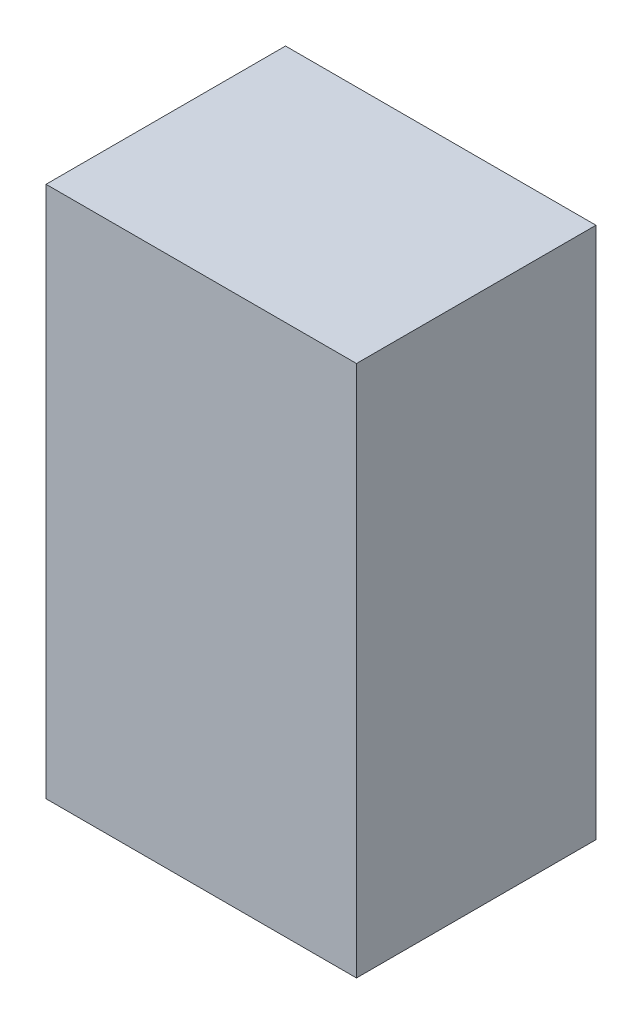
ISO-10303-21;
HEADER;
FILE_DESCRIPTION(('STEP AP214'),'2;1');
FILE_NAME('part.step','',(''),(''),'','','');
FILE_SCHEMA(('AUTOMOTIVE_DESIGN { 1 0 10303 214 1 1 1 1 }'));
ENDSEC;
DATA;
#1=APPLICATION_CONTEXT('core data for automotive mechanical design processes');
#2=APPLICATION_PROTOCOL_DEFINITION('international standard','automotive_design',2000,#1);
#3=PRODUCT_CONTEXT('',#1,'mechanical');
#4=PRODUCT('Part','Part','',(#3));
#5=PRODUCT_RELATED_PRODUCT_CATEGORY('part','',(#4));
#6=PRODUCT_DEFINITION_FORMATION('','',#4);
#7=PRODUCT_DEFINITION_CONTEXT('part definition',#1,'design');
#8=PRODUCT_DEFINITION('design','',#6,#7);
#9=PRODUCT_DEFINITION_SHAPE('','',#8);
#10=(LENGTH_UNIT() NAMED_UNIT(*) SI_UNIT(.MILLI.,.METRE.));
#11=(NAMED_UNIT(*) PLANE_ANGLE_UNIT() SI_UNIT($,.RADIAN.));
#12=(NAMED_UNIT(*) SI_UNIT($,.STERADIAN.) SOLID_ANGLE_UNIT());
#13=UNCERTAINTY_MEASURE_WITH_UNIT(LENGTH_MEASURE(1.E-05),#10,'distance_accuracy_value','');
#14=(GEOMETRIC_REPRESENTATION_CONTEXT(3) GLOBAL_UNCERTAINTY_ASSIGNED_CONTEXT((#13)) GLOBAL_UNIT_ASSIGNED_CONTEXT((#10,
#11,#12)) REPRESENTATION_CONTEXT('',''));
#15=CARTESIAN_POINT('',(0.,0.,0.));
#16=DIRECTION('',(0.,0.,1.));
#17=DIRECTION('',(1.,0.,0.));
#18=AXIS2_PLACEMENT_3D('',#15,#16,#17);
#19=CARTESIAN_POINT('',(125.4555218121,39.350875772969,1.449999595621));
#20=DIRECTION('',(0.,0.,1.));
#21=DIRECTION('',(1.,0.,0.));
#22=AXIS2_PLACEMENT_3D('',#19,#20,#21);
#23=PLANE('',#22);
#24=DIRECTION('',(-1.,0.,0.));
#25=VECTOR('',#24,1.);
#26=CARTESIAN_POINT('',(127.2055208521,39.350875772969,1.449999595621));
#27=LINE('',#26,#25);
#28=CARTESIAN_POINT('',(127.2055208521,39.350875772969,1.449999595621));
#29=VERTEX_POINT('',#28);
#30=CARTESIAN_POINT('',(125.4555218121,39.350875772969,1.449999595621));
#31=VERTEX_POINT('',#30);
#32=EDGE_CURVE('E27',#29,#31,#27,.T.);
#33=ORIENTED_EDGE('',*,*,#32,.F.);
#34=DIRECTION('',(0.,-1.,0.));
#35=VECTOR('',#34,1.);
#36=CARTESIAN_POINT('',(127.2055208521,42.350874852969,1.449999595621));
#37=LINE('',#36,#35);
#38=CARTESIAN_POINT('',(127.2055208521,42.350874852969,1.449999595621));
#39=VERTEX_POINT('',#38);
#40=EDGE_CURVE('E79',#39,#29,#37,.T.);
#41=ORIENTED_EDGE('',*,*,#40,.F.);
#42=DIRECTION('',(1.,0.,0.));
#43=VECTOR('',#42,1.);
#44=CARTESIAN_POINT('',(125.4555218121,42.350874852969,1.449999595621));
#45=LINE('',#44,#43);
#46=CARTESIAN_POINT('',(125.4555218121,42.350874852969,1.449999595621));
#47=VERTEX_POINT('',#46);
#48=EDGE_CURVE('E73',#47,#39,#45,.T.);
#49=ORIENTED_EDGE('',*,*,#48,.F.);
#50=DIRECTION('',(0.,1.,0.));
#51=VECTOR('',#50,1.);
#52=CARTESIAN_POINT('',(125.4555218121,39.350875772969,1.449999595621));
#53=LINE('',#52,#51);
#54=EDGE_CURVE('E76',#31,#47,#53,.T.);
#55=ORIENTED_EDGE('',*,*,#54,.F.);
#56=EDGE_LOOP('',(#33,#41,#49,#55));
#57=FACE_BOUND('',#56,.T.);
#58=ADVANCED_FACE('F16',(#57),#23,.T.);
#59=CARTESIAN_POINT('',(125.4555218121,39.350875772969,0.09999975562096));
#60=DIRECTION('',(0.,0.,1.));
#61=DIRECTION('',(1.,0.,0.));
#62=AXIS2_PLACEMENT_3D('',#59,#60,#61);
#63=PLANE('',#62);
#64=DIRECTION('',(0.,1.,0.));
#65=VECTOR('',#64,1.);
#66=CARTESIAN_POINT('',(125.4555218121,39.350875772969,0.09999975562096));
#67=LINE('',#66,#65);
#68=CARTESIAN_POINT('',(125.4555218121,39.350875772969,0.09999975562096));
#69=VERTEX_POINT('',#68);
#70=CARTESIAN_POINT('',(125.4555218121,42.350874852969,0.09999975562096));
#71=VERTEX_POINT('',#70);
#72=EDGE_CURVE('E85',#69,#71,#67,.T.);
#73=ORIENTED_EDGE('',*,*,#72,.T.);
#74=DIRECTION('',(1.,0.,0.));
#75=VECTOR('',#74,1.);
#76=CARTESIAN_POINT('',(125.4555218121,42.350874852969,0.09999975562096));
#77=LINE('',#76,#75);
#78=CARTESIAN_POINT('',(127.2055208521,42.350874852969,0.09999975562096));
#79=VERTEX_POINT('',#78);
#80=EDGE_CURVE('E90',#71,#79,#77,.T.);
#81=ORIENTED_EDGE('',*,*,#80,.T.);
#82=DIRECTION('',(0.,-1.,0.));
#83=VECTOR('',#82,1.);
#84=CARTESIAN_POINT('',(127.2055208521,42.350874852969,0.09999975562096));
#85=LINE('',#84,#83);
#86=CARTESIAN_POINT('',(127.2055208521,39.350875772969,0.09999975562096));
#87=VERTEX_POINT('',#86);
#88=EDGE_CURVE('E108',#79,#87,#85,.T.);
#89=ORIENTED_EDGE('',*,*,#88,.T.);
#90=DIRECTION('',(-1.,0.,0.));
#91=VECTOR('',#90,1.);
#92=CARTESIAN_POINT('',(127.2055208521,39.350875772969,0.09999975562096));
#93=LINE('',#92,#91);
#94=EDGE_CURVE('E11',#87,#69,#93,.T.);
#95=ORIENTED_EDGE('',*,*,#94,.T.);
#96=EDGE_LOOP('',(#73,#81,#89,#95));
#97=FACE_BOUND('',#96,.T.);
#98=ADVANCED_FACE('F160',(#97),#63,.F.);
#99=CARTESIAN_POINT('',(127.2055208521,39.350875772969,0.09999975562096));
#100=DIRECTION('',(0.,-1.,0.));
#101=DIRECTION('',(0.,0.,-1.));
#102=AXIS2_PLACEMENT_3D('',#99,#100,#101);
#103=PLANE('',#102);
#104=DIRECTION('',(0.,0.,1.));
#105=VECTOR('',#104,1.);
#106=CARTESIAN_POINT('',(127.2055208521,39.350875772969,0.09999975562096));
#107=LINE('',#106,#105);
#108=EDGE_CURVE('E105',#87,#29,#107,.T.);
#109=ORIENTED_EDGE('',*,*,#108,.T.);
#110=ORIENTED_EDGE('',*,*,#32,.T.);
#111=DIRECTION('',(0.,0.,1.));
#112=VECTOR('',#111,1.);
#113=CARTESIAN_POINT('',(125.4555218121,39.350875772969,0.09999975562096));
#114=LINE('',#113,#112);
#115=EDGE_CURVE('E94',#69,#31,#114,.T.);
#116=ORIENTED_EDGE('',*,*,#115,.F.);
#117=ORIENTED_EDGE('',*,*,#94,.F.);
#118=EDGE_LOOP('',(#109,#110,#116,#117));
#119=FACE_BOUND('',#118,.T.);
#120=ADVANCED_FACE('F187',(#119),#103,.T.);
#121=CARTESIAN_POINT('',(127.2055208521,42.350874852969,0.09999975562096));
#122=DIRECTION('',(1.,0.,0.));
#123=DIRECTION('',(0.,1.,0.));
#124=AXIS2_PLACEMENT_3D('',#121,#122,#123);
#125=PLANE('',#124);
#126=DIRECTION('',(0.,0.,1.));
#127=VECTOR('',#126,1.);
#128=CARTESIAN_POINT('',(127.2055208521,42.350874852969,0.09999975562096));
#129=LINE('',#128,#127);
#130=EDGE_CURVE('E84',#79,#39,#129,.T.);
#131=ORIENTED_EDGE('',*,*,#130,.T.);
#132=ORIENTED_EDGE('',*,*,#40,.T.);
#133=ORIENTED_EDGE('',*,*,#108,.F.);
#134=ORIENTED_EDGE('',*,*,#88,.F.);
#135=EDGE_LOOP('',(#131,#132,#133,#134));
#136=FACE_BOUND('',#135,.T.);
#137=ADVANCED_FACE('F18',(#136),#125,.T.);
#138=CARTESIAN_POINT('',(125.4555218121,42.350874852969,0.09999975562096));
#139=DIRECTION('',(0.,1.,0.));
#140=DIRECTION('',(1.,0.,0.));
#141=AXIS2_PLACEMENT_3D('',#138,#139,#140);
#142=PLANE('',#141);
#143=DIRECTION('',(0.,0.,1.));
#144=VECTOR('',#143,1.);
#145=CARTESIAN_POINT('',(125.4555218121,42.350874852969,0.09999975562096));
#146=LINE('',#145,#144);
#147=EDGE_CURVE('E20',#71,#47,#146,.T.);
#148=ORIENTED_EDGE('',*,*,#147,.T.);
#149=ORIENTED_EDGE('',*,*,#48,.T.);
#150=ORIENTED_EDGE('',*,*,#130,.F.);
#151=ORIENTED_EDGE('',*,*,#80,.F.);
#152=EDGE_LOOP('',(#148,#149,#150,#151));
#153=FACE_BOUND('',#152,.T.);
#154=ADVANCED_FACE('F88',(#153),#142,.T.);
#155=CARTESIAN_POINT('',(125.4555218121,39.350875772969,0.09999975562096));
#156=DIRECTION('',(-1.,0.,0.));
#157=DIRECTION('',(0.,0.,1.));
#158=AXIS2_PLACEMENT_3D('',#155,#156,#157);
#159=PLANE('',#158);
#160=ORIENTED_EDGE('',*,*,#115,.T.);
#161=ORIENTED_EDGE('',*,*,#54,.T.);
#162=ORIENTED_EDGE('',*,*,#147,.F.);
#163=ORIENTED_EDGE('',*,*,#72,.F.);
#164=EDGE_LOOP('',(#160,#161,#162,#163));
#165=FACE_BOUND('',#164,.T.);
#166=ADVANCED_FACE('F93',(#165),#159,.T.);
#167=CLOSED_SHELL('',(#58,#98,#120,#137,#154,#166));
#168=MANIFOLD_SOLID_BREP('B1',#167);
#169=ADVANCED_BREP_SHAPE_REPRESENTATION('',(#18,#168),#14);
#170=SHAPE_DEFINITION_REPRESENTATION(#9,#169);
ENDSEC;
END-ISO-10303-21;
